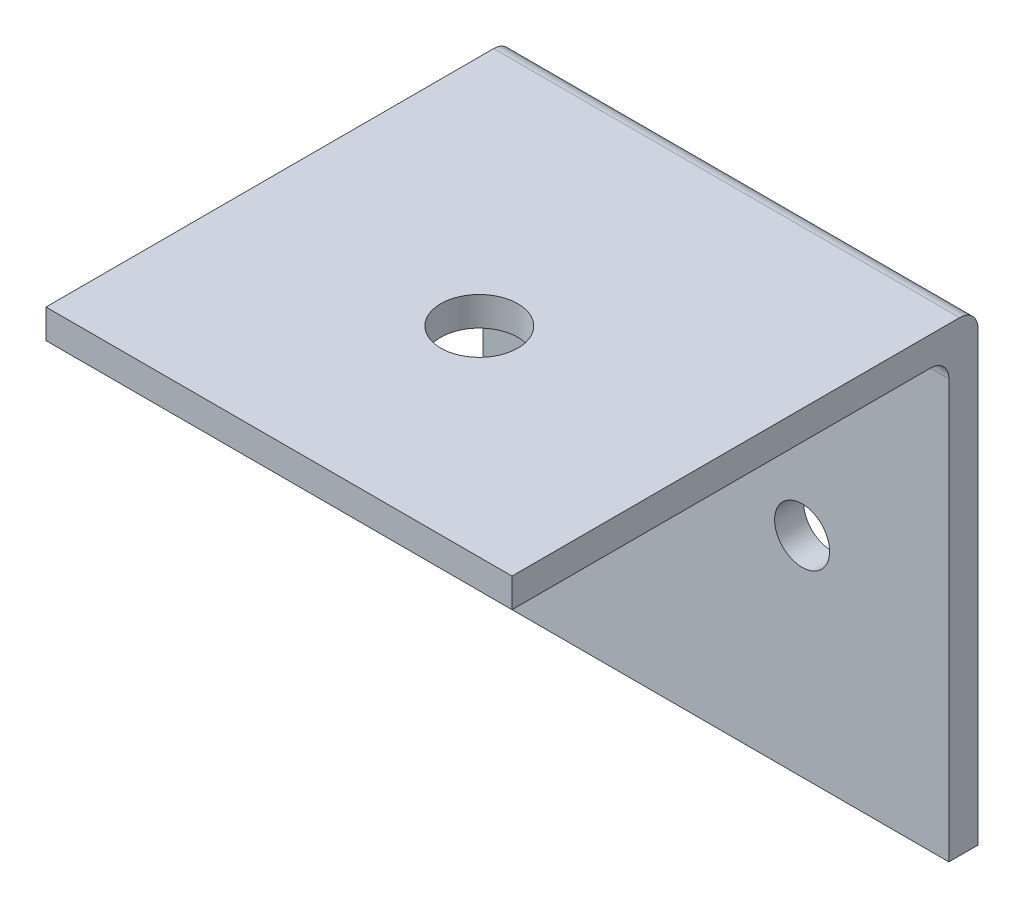
ISO-10303-21;
HEADER;
FILE_DESCRIPTION(('STEP AP214'),'2;1');
FILE_NAME('part.step','',(''),(''),'','','');
FILE_SCHEMA(('AUTOMOTIVE_DESIGN { 1 0 10303 214 1 1 1 1 }'));
ENDSEC;
DATA;
#1=APPLICATION_CONTEXT('core data for automotive mechanical design processes');
#2=APPLICATION_PROTOCOL_DEFINITION('international standard','automotive_design',2000,#1);
#3=PRODUCT_CONTEXT('',#1,'mechanical');
#4=PRODUCT('Part','Part','',(#3));
#5=PRODUCT_RELATED_PRODUCT_CATEGORY('part','',(#4));
#6=PRODUCT_DEFINITION_FORMATION('','',#4);
#7=PRODUCT_DEFINITION_CONTEXT('part definition',#1,'design');
#8=PRODUCT_DEFINITION('design','',#6,#7);
#9=PRODUCT_DEFINITION_SHAPE('','',#8);
#10=(LENGTH_UNIT() NAMED_UNIT(*) SI_UNIT(.MILLI.,.METRE.));
#11=(NAMED_UNIT(*) PLANE_ANGLE_UNIT() SI_UNIT($,.RADIAN.));
#12=(NAMED_UNIT(*) SI_UNIT($,.STERADIAN.) SOLID_ANGLE_UNIT());
#13=UNCERTAINTY_MEASURE_WITH_UNIT(LENGTH_MEASURE(1.E-05),#10,'distance_accuracy_value','');
#14=(GEOMETRIC_REPRESENTATION_CONTEXT(3) GLOBAL_UNCERTAINTY_ASSIGNED_CONTEXT((#13)) GLOBAL_UNIT_ASSIGNED_CONTEXT((#10,
#11,#12)) REPRESENTATION_CONTEXT('',''));
#15=CARTESIAN_POINT('',(0.,0.,0.));
#16=DIRECTION('',(0.,0.,1.));
#17=DIRECTION('',(1.,0.,0.));
#18=AXIS2_PLACEMENT_3D('',#15,#16,#17);
#19=CARTESIAN_POINT('',(25.4,10.1125,-10.1125));
#20=DIRECTION('',(-1.,0.,0.));
#21=DIRECTION('',(0.,0.,1.));
#22=AXIS2_PLACEMENT_3D('',#19,#20,#21);
#23=CYLINDRICAL_SURFACE('',#22,1.);
#24=CARTESIAN_POINT('',(0.,10.1125,-10.1125));
#25=DIRECTION('',(-1.,0.,0.));
#26=DIRECTION('',(0.,0.,1.));
#27=AXIS2_PLACEMENT_3D('',#24,#25,#26);
#28=CIRCLE('',#27,1.);
#29=CARTESIAN_POINT('',(0.,11.1125,-10.1125));
#30=VERTEX_POINT('',#29);
#31=CARTESIAN_POINT('',(0.,10.1125,-11.1125));
#32=VERTEX_POINT('',#31);
#33=EDGE_CURVE('E131',#30,#32,#28,.T.);
#34=ORIENTED_EDGE('',*,*,#33,.T.);
#35=DIRECTION('',(-1.,0.,0.));
#36=VECTOR('',#35,1.);
#37=CARTESIAN_POINT('',(25.4,10.1125,-11.1125));
#38=LINE('',#37,#36);
#39=CARTESIAN_POINT('',(25.4,10.1125,-11.1125));
#40=VERTEX_POINT('',#39);
#41=EDGE_CURVE('E11',#40,#32,#38,.T.);
#42=ORIENTED_EDGE('',*,*,#41,.F.);
#43=CARTESIAN_POINT('',(25.4,10.1125,-10.1125));
#44=DIRECTION('',(-1.,0.,0.));
#45=DIRECTION('',(0.,0.,1.));
#46=AXIS2_PLACEMENT_3D('',#43,#44,#45);
#47=CIRCLE('',#46,1.);
#48=CARTESIAN_POINT('',(25.4,11.1125,-10.1125));
#49=VERTEX_POINT('',#48);
#50=EDGE_CURVE('E146',#49,#40,#47,.T.);
#51=ORIENTED_EDGE('',*,*,#50,.F.);
#52=DIRECTION('',(-1.,0.,0.));
#53=VECTOR('',#52,1.);
#54=CARTESIAN_POINT('',(25.4,11.1125,-10.1125));
#55=LINE('',#54,#53);
#56=EDGE_CURVE('E127',#49,#30,#55,.T.);
#57=ORIENTED_EDGE('',*,*,#56,.T.);
#58=EDGE_LOOP('',(#34,#42,#51,#57));
#59=FACE_BOUND('',#58,.T.);
#60=ADVANCED_FACE('F33',(#59),#23,.F.);
#61=CARTESIAN_POINT('',(25.4,-12.7,-11.1125));
#62=DIRECTION('',(0.,0.,-1.));
#63=DIRECTION('',(-1.,0.,0.));
#64=AXIS2_PLACEMENT_3D('',#61,#62,#63);
#65=PLANE('',#64);
#66=CARTESIAN_POINT('',(17.4,-1.29375,-11.1125));
#67=DIRECTION('',(0.,0.,1.));
#68=DIRECTION('',(1.,0.,0.));
#69=AXIS2_PLACEMENT_3D('',#66,#67,#68);
#70=CIRCLE('',#69,1.5);
#71=CARTESIAN_POINT('',(18.9,-1.29375,-11.1125));
#72=VERTEX_POINT('',#71);
#73=EDGE_CURVE('E166',#72,#72,#70,.T.);
#74=ORIENTED_EDGE('',*,*,#73,.F.);
#75=EDGE_LOOP('',(#74));
#76=FACE_BOUND('',#75,.T.);
#77=CARTESIAN_POINT('',(8.,-1.29375,-11.1125));
#78=DIRECTION('',(0.,0.,1.));
#79=DIRECTION('',(1.,0.,0.));
#80=AXIS2_PLACEMENT_3D('',#77,#78,#79);
#81=CIRCLE('',#80,1.5);
#82=CARTESIAN_POINT('',(9.5,-1.29375,-11.1125));
#83=VERTEX_POINT('',#82);
#84=EDGE_CURVE('E158',#83,#83,#81,.T.);
#85=ORIENTED_EDGE('',*,*,#84,.F.);
#86=EDGE_LOOP('',(#85));
#87=FACE_BOUND('',#86,.T.);
#88=DIRECTION('',(0.,-1.,0.));
#89=VECTOR('',#88,1.);
#90=CARTESIAN_POINT('',(0.,-12.7,-11.1125));
#91=LINE('',#90,#89);
#92=CARTESIAN_POINT('',(0.,-12.7,-11.1125));
#93=VERTEX_POINT('',#92);
#94=EDGE_CURVE('E134',#32,#93,#91,.T.);
#95=ORIENTED_EDGE('',*,*,#94,.T.);
#96=DIRECTION('',(-1.,0.,0.));
#97=VECTOR('',#96,1.);
#98=CARTESIAN_POINT('',(25.4,-12.7,-11.1125));
#99=LINE('',#98,#97);
#100=CARTESIAN_POINT('',(25.4,-12.7,-11.1125));
#101=VERTEX_POINT('',#100);
#102=EDGE_CURVE('E42',#101,#93,#99,.T.);
#103=ORIENTED_EDGE('',*,*,#102,.F.);
#104=DIRECTION('',(0.,-1.,0.));
#105=VECTOR('',#104,1.);
#106=CARTESIAN_POINT('',(25.4,-12.7,-11.1125));
#107=LINE('',#106,#105);
#108=EDGE_CURVE('E94',#40,#101,#107,.T.);
#109=ORIENTED_EDGE('',*,*,#108,.F.);
#110=ORIENTED_EDGE('',*,*,#41,.T.);
#111=EDGE_LOOP('',(#95,#103,#109,#110));
#112=FACE_BOUND('',#111,.T.);
#113=ADVANCED_FACE('F205',(#76,#87,#112),#65,.F.);
#114=CARTESIAN_POINT('',(25.4,-12.7,-11.1125));
#115=DIRECTION('',(0.,1.,0.));
#116=DIRECTION('',(0.,0.,1.));
#117=AXIS2_PLACEMENT_3D('',#114,#115,#116);
#118=PLANE('',#117);
#119=DIRECTION('',(0.,0.,-1.));
#120=VECTOR('',#119,1.);
#121=CARTESIAN_POINT('',(0.,-12.7,-11.1125));
#122=LINE('',#121,#120);
#123=CARTESIAN_POINT('',(0.,-12.7,-12.7));
#124=VERTEX_POINT('',#123);
#125=EDGE_CURVE('E137',#93,#124,#122,.T.);
#126=ORIENTED_EDGE('',*,*,#125,.T.);
#127=DIRECTION('',(-1.,0.,0.));
#128=VECTOR('',#127,1.);
#129=CARTESIAN_POINT('',(25.4,-12.7,-12.7));
#130=LINE('',#129,#128);
#131=CARTESIAN_POINT('',(25.4,-12.7,-12.7));
#132=VERTEX_POINT('',#131);
#133=EDGE_CURVE('E153',#132,#124,#130,.T.);
#134=ORIENTED_EDGE('',*,*,#133,.F.);
#135=DIRECTION('',(0.,0.,-1.));
#136=VECTOR('',#135,1.);
#137=CARTESIAN_POINT('',(25.4,-12.7,-11.1125));
#138=LINE('',#137,#136);
#139=EDGE_CURVE('E172',#101,#132,#138,.T.);
#140=ORIENTED_EDGE('',*,*,#139,.F.);
#141=ORIENTED_EDGE('',*,*,#102,.T.);
#142=EDGE_LOOP('',(#126,#134,#140,#141));
#143=FACE_BOUND('',#142,.T.);
#144=ADVANCED_FACE('F209',(#143),#118,.F.);
#145=CARTESIAN_POINT('',(25.4,-12.7,-12.7));
#146=DIRECTION('',(0.,0.,1.));
#147=DIRECTION('',(1.,0.,0.));
#148=AXIS2_PLACEMENT_3D('',#145,#146,#147);
#149=PLANE('',#148);
#150=CARTESIAN_POINT('',(17.4,-1.29375,-12.7));
#151=DIRECTION('',(0.,0.,1.));
#152=DIRECTION('',(1.,0.,0.));
#153=AXIS2_PLACEMENT_3D('',#150,#151,#152);
#154=CIRCLE('',#153,1.5);
#155=CARTESIAN_POINT('',(18.9,-1.29375,-12.7));
#156=VERTEX_POINT('',#155);
#157=EDGE_CURVE('E36',#156,#156,#154,.T.);
#158=ORIENTED_EDGE('',*,*,#157,.T.);
#159=EDGE_LOOP('',(#158));
#160=FACE_BOUND('',#159,.T.);
#161=CARTESIAN_POINT('',(8.,-1.29375,-12.7));
#162=DIRECTION('',(0.,0.,1.));
#163=DIRECTION('',(1.,0.,0.));
#164=AXIS2_PLACEMENT_3D('',#161,#162,#163);
#165=CIRCLE('',#164,1.5);
#166=CARTESIAN_POINT('',(9.5,-1.29375,-12.7));
#167=VERTEX_POINT('',#166);
#168=EDGE_CURVE('E135',#167,#167,#165,.T.);
#169=ORIENTED_EDGE('',*,*,#168,.T.);
#170=EDGE_LOOP('',(#169));
#171=FACE_BOUND('',#170,.T.);
#172=DIRECTION('',(0.,1.,0.));
#173=VECTOR('',#172,1.);
#174=CARTESIAN_POINT('',(0.,-12.7,-12.7));
#175=LINE('',#174,#173);
#176=CARTESIAN_POINT('',(0.,11.7,-12.7));
#177=VERTEX_POINT('',#176);
#178=EDGE_CURVE('E139',#124,#177,#175,.T.);
#179=ORIENTED_EDGE('',*,*,#178,.T.);
#180=DIRECTION('',(-1.,0.,0.));
#181=VECTOR('',#180,1.);
#182=CARTESIAN_POINT('',(25.4,11.7,-12.7));
#183=LINE('',#182,#181);
#184=CARTESIAN_POINT('',(25.4,11.7,-12.7));
#185=VERTEX_POINT('',#184);
#186=EDGE_CURVE('E150',#185,#177,#183,.T.);
#187=ORIENTED_EDGE('',*,*,#186,.F.);
#188=DIRECTION('',(0.,1.,0.));
#189=VECTOR('',#188,1.);
#190=CARTESIAN_POINT('',(25.4,-12.7,-12.7));
#191=LINE('',#190,#189);
#192=EDGE_CURVE('E174',#132,#185,#191,.T.);
#193=ORIENTED_EDGE('',*,*,#192,.F.);
#194=ORIENTED_EDGE('',*,*,#133,.T.);
#195=EDGE_LOOP('',(#179,#187,#193,#194));
#196=FACE_BOUND('',#195,.T.);
#197=ADVANCED_FACE('F180',(#160,#171,#196),#149,.F.);
#198=CARTESIAN_POINT('',(25.4,11.7,-11.7));
#199=DIRECTION('',(-1.,0.,0.));
#200=DIRECTION('',(0.,0.,1.));
#201=AXIS2_PLACEMENT_3D('',#198,#199,#200);
#202=CYLINDRICAL_SURFACE('',#201,1.);
#203=CARTESIAN_POINT('',(0.,11.7,-11.7));
#204=DIRECTION('',(1.,0.,0.));
#205=DIRECTION('',(0.,0.,1.));
#206=AXIS2_PLACEMENT_3D('',#203,#204,#205);
#207=CIRCLE('',#206,1.);
#208=CARTESIAN_POINT('',(0.,12.7,-11.7));
#209=VERTEX_POINT('',#208);
#210=EDGE_CURVE('E141',#177,#209,#207,.T.);
#211=ORIENTED_EDGE('',*,*,#210,.T.);
#212=DIRECTION('',(-1.,0.,0.));
#213=VECTOR('',#212,1.);
#214=CARTESIAN_POINT('',(25.4,12.7,-11.7));
#215=LINE('',#214,#213);
#216=CARTESIAN_POINT('',(25.4,12.7,-11.7));
#217=VERTEX_POINT('',#216);
#218=EDGE_CURVE('E122',#217,#209,#215,.T.);
#219=ORIENTED_EDGE('',*,*,#218,.F.);
#220=CARTESIAN_POINT('',(25.4,11.7,-11.7));
#221=DIRECTION('',(1.,0.,0.));
#222=DIRECTION('',(0.,0.,1.));
#223=AXIS2_PLACEMENT_3D('',#220,#221,#222);
#224=CIRCLE('',#223,1.);
#225=EDGE_CURVE('E113',#185,#217,#224,.T.);
#226=ORIENTED_EDGE('',*,*,#225,.F.);
#227=ORIENTED_EDGE('',*,*,#186,.T.);
#228=EDGE_LOOP('',(#211,#219,#226,#227));
#229=FACE_BOUND('',#228,.T.);
#230=ADVANCED_FACE('F184',(#229),#202,.T.);
#231=CARTESIAN_POINT('',(25.4,12.7,12.7));
#232=DIRECTION('',(0.,-1.,0.));
#233=DIRECTION('',(0.,0.,-1.));
#234=AXIS2_PLACEMENT_3D('',#231,#232,#233);
#235=PLANE('',#234);
#236=CARTESIAN_POINT('',(12.7,12.7,1.7831547843513));
#237=DIRECTION('',(0.,-1.,0.));
#238=DIRECTION('',(0.,0.,-1.));
#239=AXIS2_PLACEMENT_3D('',#236,#237,#238);
#240=CIRCLE('',#239,2.1);
#241=CARTESIAN_POINT('',(12.7,12.7,-0.316845215648705));
#242=VERTEX_POINT('',#241);
#243=EDGE_CURVE('E230',#242,#242,#240,.T.);
#244=ORIENTED_EDGE('',*,*,#243,.T.);
#245=EDGE_LOOP('',(#244));
#246=FACE_BOUND('',#245,.T.);
#247=DIRECTION('',(0.,0.,1.));
#248=VECTOR('',#247,1.);
#249=CARTESIAN_POINT('',(0.,12.7,12.7));
#250=LINE('',#249,#248);
#251=CARTESIAN_POINT('',(0.,12.7,12.7));
#252=VERTEX_POINT('',#251);
#253=EDGE_CURVE('E121',#209,#252,#250,.T.);
#254=ORIENTED_EDGE('',*,*,#253,.T.);
#255=DIRECTION('',(-1.,0.,0.));
#256=VECTOR('',#255,1.);
#257=CARTESIAN_POINT('',(25.4,12.7,12.7));
#258=LINE('',#257,#256);
#259=CARTESIAN_POINT('',(25.4,12.7,12.7));
#260=VERTEX_POINT('',#259);
#261=EDGE_CURVE('E118',#260,#252,#258,.T.);
#262=ORIENTED_EDGE('',*,*,#261,.F.);
#263=DIRECTION('',(0.,0.,1.));
#264=VECTOR('',#263,1.);
#265=CARTESIAN_POINT('',(25.4,12.7,12.7));
#266=LINE('',#265,#264);
#267=EDGE_CURVE('E107',#217,#260,#266,.T.);
#268=ORIENTED_EDGE('',*,*,#267,.F.);
#269=ORIENTED_EDGE('',*,*,#218,.T.);
#270=EDGE_LOOP('',(#254,#262,#268,#269));
#271=FACE_BOUND('',#270,.T.);
#272=ADVANCED_FACE('F119',(#246,#271),#235,.F.);
#273=CARTESIAN_POINT('',(25.4,11.1125,12.7));
#274=DIRECTION('',(0.,0.,-1.));
#275=DIRECTION('',(-1.,0.,0.));
#276=AXIS2_PLACEMENT_3D('',#273,#274,#275);
#277=PLANE('',#276);
#278=DIRECTION('',(0.,-1.,0.));
#279=VECTOR('',#278,1.);
#280=CARTESIAN_POINT('',(0.,11.1125,12.7));
#281=LINE('',#280,#279);
#282=CARTESIAN_POINT('',(0.,11.1125,12.7));
#283=VERTEX_POINT('',#282);
#284=EDGE_CURVE('E80',#252,#283,#281,.T.);
#285=ORIENTED_EDGE('',*,*,#284,.T.);
#286=DIRECTION('',(-1.,0.,0.));
#287=VECTOR('',#286,1.);
#288=CARTESIAN_POINT('',(25.4,11.1125,12.7));
#289=LINE('',#288,#287);
#290=CARTESIAN_POINT('',(25.4,11.1125,12.7));
#291=VERTEX_POINT('',#290);
#292=EDGE_CURVE('E123',#291,#283,#289,.T.);
#293=ORIENTED_EDGE('',*,*,#292,.F.);
#294=DIRECTION('',(0.,-1.,0.));
#295=VECTOR('',#294,1.);
#296=CARTESIAN_POINT('',(25.4,11.1125,12.7));
#297=LINE('',#296,#295);
#298=EDGE_CURVE('E111',#260,#291,#297,.T.);
#299=ORIENTED_EDGE('',*,*,#298,.F.);
#300=ORIENTED_EDGE('',*,*,#261,.T.);
#301=EDGE_LOOP('',(#285,#293,#299,#300));
#302=FACE_BOUND('',#301,.T.);
#303=ADVANCED_FACE('F125',(#302),#277,.F.);
#304=CARTESIAN_POINT('',(25.4,11.1125,12.7));
#305=DIRECTION('',(0.,1.,0.));
#306=DIRECTION('',(0.,0.,1.));
#307=AXIS2_PLACEMENT_3D('',#304,#305,#306);
#308=PLANE('',#307);
#309=CARTESIAN_POINT('',(12.7,11.1125,1.7831547843513));
#310=DIRECTION('',(0.,-1.,0.));
#311=DIRECTION('',(0.,0.,-1.));
#312=AXIS2_PLACEMENT_3D('',#309,#310,#311);
#313=CIRCLE('',#312,2.1);
#314=CARTESIAN_POINT('',(12.7,11.1125,-0.316845215648705));
#315=VERTEX_POINT('',#314);
#316=EDGE_CURVE('E232',#315,#315,#313,.T.);
#317=ORIENTED_EDGE('',*,*,#316,.F.);
#318=EDGE_LOOP('',(#317));
#319=FACE_BOUND('',#318,.T.);
#320=DIRECTION('',(0.,0.,-1.));
#321=VECTOR('',#320,1.);
#322=CARTESIAN_POINT('',(0.,11.1125,12.7));
#323=LINE('',#322,#321);
#324=EDGE_CURVE('E86',#283,#30,#323,.T.);
#325=ORIENTED_EDGE('',*,*,#324,.T.);
#326=ORIENTED_EDGE('',*,*,#56,.F.);
#327=DIRECTION('',(0.,0.,-1.));
#328=VECTOR('',#327,1.);
#329=CARTESIAN_POINT('',(25.4,11.1125,12.7));
#330=LINE('',#329,#328);
#331=EDGE_CURVE('E51',#291,#49,#330,.T.);
#332=ORIENTED_EDGE('',*,*,#331,.F.);
#333=ORIENTED_EDGE('',*,*,#292,.T.);
#334=EDGE_LOOP('',(#325,#326,#332,#333));
#335=FACE_BOUND('',#334,.T.);
#336=ADVANCED_FACE('F192',(#319,#335),#308,.F.);
#337=CARTESIAN_POINT('',(25.4,10.1125,-10.1125));
#338=DIRECTION('',(-1.,0.,0.));
#339=DIRECTION('',(0.,0.,1.));
#340=AXIS2_PLACEMENT_3D('',#337,#338,#339);
#341=PLANE('',#340);
#342=ORIENTED_EDGE('',*,*,#50,.T.);
#343=ORIENTED_EDGE('',*,*,#108,.T.);
#344=ORIENTED_EDGE('',*,*,#139,.T.);
#345=ORIENTED_EDGE('',*,*,#192,.T.);
#346=ORIENTED_EDGE('',*,*,#225,.T.);
#347=ORIENTED_EDGE('',*,*,#267,.T.);
#348=ORIENTED_EDGE('',*,*,#298,.T.);
#349=ORIENTED_EDGE('',*,*,#331,.T.);
#350=EDGE_LOOP('',(#342,#343,#344,#345,#346,#347,#348,#349));
#351=FACE_BOUND('',#350,.T.);
#352=ADVANCED_FACE('F109',(#351),#341,.F.);
#353=CARTESIAN_POINT('',(0.,10.1125,-10.1125));
#354=DIRECTION('',(-1.,0.,0.));
#355=DIRECTION('',(0.,0.,1.));
#356=AXIS2_PLACEMENT_3D('',#353,#354,#355);
#357=PLANE('',#356);
#358=ORIENTED_EDGE('',*,*,#33,.F.);
#359=ORIENTED_EDGE('',*,*,#324,.F.);
#360=ORIENTED_EDGE('',*,*,#284,.F.);
#361=ORIENTED_EDGE('',*,*,#253,.F.);
#362=ORIENTED_EDGE('',*,*,#210,.F.);
#363=ORIENTED_EDGE('',*,*,#178,.F.);
#364=ORIENTED_EDGE('',*,*,#125,.F.);
#365=ORIENTED_EDGE('',*,*,#94,.F.);
#366=EDGE_LOOP('',(#358,#359,#360,#361,#362,#363,#364,#365));
#367=FACE_BOUND('',#366,.T.);
#368=ADVANCED_FACE('F187',(#367),#357,.T.);
#369=CARTESIAN_POINT('',(8.,-1.29375,-36.5125));
#370=DIRECTION('',(0.,0.,1.));
#371=DIRECTION('',(1.,0.,0.));
#372=AXIS2_PLACEMENT_3D('',#369,#370,#371);
#373=CYLINDRICAL_SURFACE('',#372,1.5);
#374=ORIENTED_EDGE('',*,*,#84,.T.);
#375=EDGE_LOOP('',(#374));
#376=FACE_BOUND('',#375,.T.);
#377=ORIENTED_EDGE('',*,*,#168,.F.);
#378=EDGE_LOOP('',(#377));
#379=FACE_BOUND('',#378,.T.);
#380=ADVANCED_FACE('F244',(#376,#379),#373,.F.);
#381=CARTESIAN_POINT('',(17.4,-1.29375,-36.5125));
#382=DIRECTION('',(0.,0.,1.));
#383=DIRECTION('',(1.,0.,0.));
#384=AXIS2_PLACEMENT_3D('',#381,#382,#383);
#385=CYLINDRICAL_SURFACE('',#384,1.5);
#386=ORIENTED_EDGE('',*,*,#73,.T.);
#387=EDGE_LOOP('',(#386));
#388=FACE_BOUND('',#387,.T.);
#389=ORIENTED_EDGE('',*,*,#157,.F.);
#390=EDGE_LOOP('',(#389));
#391=FACE_BOUND('',#390,.T.);
#392=ADVANCED_FACE('F239',(#388,#391),#385,.F.);
#393=CARTESIAN_POINT('',(12.7,36.5125,1.78315478435129));
#394=DIRECTION('',(0.,-1.,0.));
#395=DIRECTION('',(0.,0.,-1.));
#396=AXIS2_PLACEMENT_3D('',#393,#394,#395);
#397=CYLINDRICAL_SURFACE('',#396,2.1);
#398=ORIENTED_EDGE('',*,*,#316,.T.);
#399=EDGE_LOOP('',(#398));
#400=FACE_BOUND('',#399,.T.);
#401=ORIENTED_EDGE('',*,*,#243,.F.);
#402=EDGE_LOOP('',(#401));
#403=FACE_BOUND('',#402,.T.);
#404=ADVANCED_FACE('F237',(#400,#403),#397,.F.);
#405=CLOSED_SHELL('',(#60,#113,#144,#197,#230,#272,#303,#336,#352,#368,#380,#392,#404));
#406=MANIFOLD_SOLID_BREP('B2',#405);
#407=ADVANCED_BREP_SHAPE_REPRESENTATION('',(#18,#406),#14);
#408=SHAPE_DEFINITION_REPRESENTATION(#9,#407);
ENDSEC;
END-ISO-10303-21;
